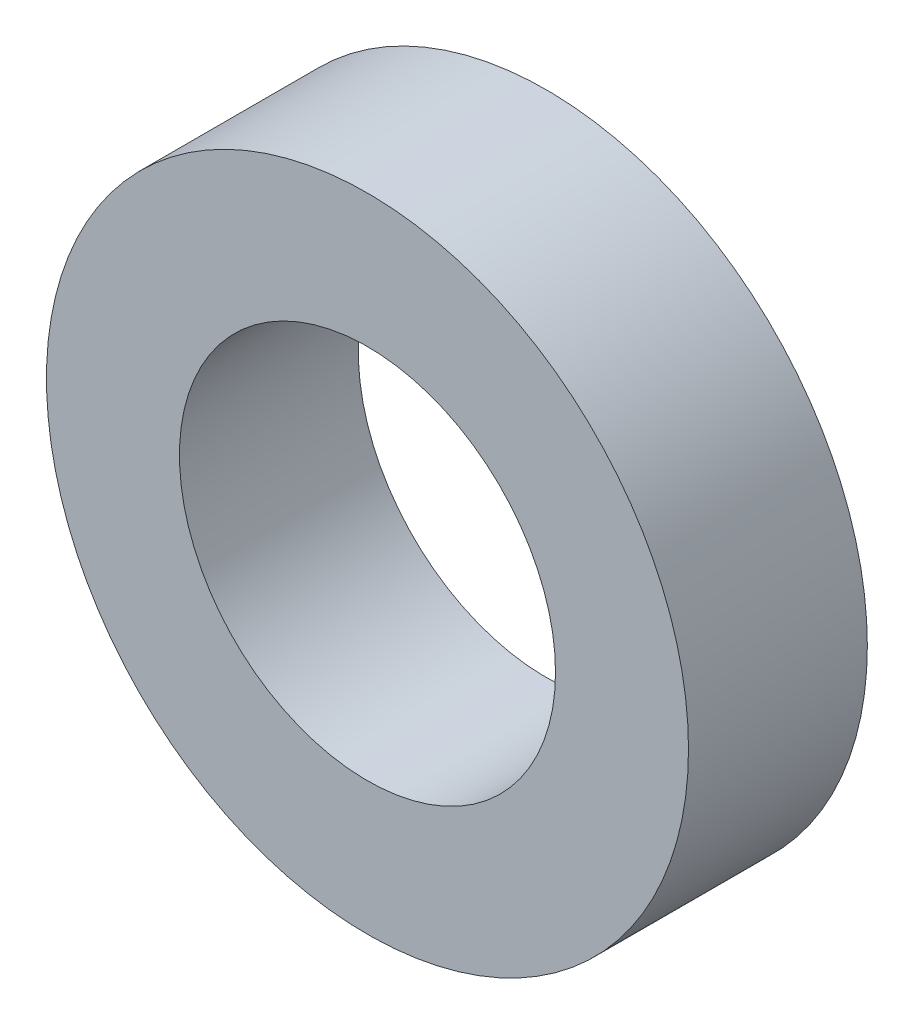
ISO-10303-21;
HEADER;
FILE_DESCRIPTION(('STEP AP214'),'2;1');
FILE_NAME('part.step','',(''),(''),'','','');
FILE_SCHEMA(('AUTOMOTIVE_DESIGN { 1 0 10303 214 1 1 1 1 }'));
ENDSEC;
DATA;
#1=APPLICATION_CONTEXT('core data for automotive mechanical design processes');
#2=APPLICATION_PROTOCOL_DEFINITION('international standard','automotive_design',2000,#1);
#3=PRODUCT_CONTEXT('',#1,'mechanical');
#4=PRODUCT('Part','Part','',(#3));
#5=PRODUCT_RELATED_PRODUCT_CATEGORY('part','',(#4));
#6=PRODUCT_DEFINITION_FORMATION('','',#4);
#7=PRODUCT_DEFINITION_CONTEXT('part definition',#1,'design');
#8=PRODUCT_DEFINITION('design','',#6,#7);
#9=PRODUCT_DEFINITION_SHAPE('','',#8);
#10=(LENGTH_UNIT() NAMED_UNIT(*) SI_UNIT(.MILLI.,.METRE.));
#11=(NAMED_UNIT(*) PLANE_ANGLE_UNIT() SI_UNIT($,.RADIAN.));
#12=(NAMED_UNIT(*) SI_UNIT($,.STERADIAN.) SOLID_ANGLE_UNIT());
#13=UNCERTAINTY_MEASURE_WITH_UNIT(LENGTH_MEASURE(1.E-05),#10,'distance_accuracy_value','');
#14=(GEOMETRIC_REPRESENTATION_CONTEXT(3) GLOBAL_UNCERTAINTY_ASSIGNED_CONTEXT((#13)) GLOBAL_UNIT_ASSIGNED_CONTEXT((#10,
#11,#12)) REPRESENTATION_CONTEXT('',''));
#15=CARTESIAN_POINT('',(0.,0.,0.));
#16=DIRECTION('',(0.,0.,1.));
#17=DIRECTION('',(1.,0.,0.));
#18=AXIS2_PLACEMENT_3D('',#15,#16,#17);
#19=CARTESIAN_POINT('',(0.,0.,7.9248));
#20=DIRECTION('',(0.,0.,-1.));
#21=DIRECTION('',(-1.,0.,0.));
#22=AXIS2_PLACEMENT_3D('',#19,#20,#21);
#23=CYLINDRICAL_SURFACE('',#22,14.224);
#24=CARTESIAN_POINT('',(0.,0.,7.9248));
#25=DIRECTION('',(0.,0.,1.));
#26=DIRECTION('',(1.,0.,0.));
#27=AXIS2_PLACEMENT_3D('',#24,#25,#26);
#28=CIRCLE('',#27,14.224);
#29=CARTESIAN_POINT('',(14.224,0.,7.9248));
#30=VERTEX_POINT('',#29);
#31=EDGE_CURVE('E10',#30,#30,#28,.T.);
#32=ORIENTED_EDGE('',*,*,#31,.F.);
#33=EDGE_LOOP('',(#32));
#34=FACE_BOUND('',#33,.T.);
#35=CARTESIAN_POINT('',(0.,0.,0.));
#36=DIRECTION('',(0.,0.,1.));
#37=DIRECTION('',(1.,0.,0.));
#38=AXIS2_PLACEMENT_3D('',#35,#36,#37);
#39=CIRCLE('',#38,14.224);
#40=CARTESIAN_POINT('',(14.224,0.,0.));
#41=VERTEX_POINT('',#40);
#42=EDGE_CURVE('E44',#41,#41,#39,.T.);
#43=ORIENTED_EDGE('',*,*,#42,.T.);
#44=EDGE_LOOP('',(#43));
#45=FACE_BOUND('',#44,.T.);
#46=ADVANCED_FACE('F41',(#34,#45),#23,.T.);
#47=CARTESIAN_POINT('',(0.,0.,7.9248));
#48=DIRECTION('',(0.,0.,1.));
#49=DIRECTION('',(1.,0.,0.));
#50=AXIS2_PLACEMENT_3D('',#47,#48,#49);
#51=PLANE('',#50);
#52=CARTESIAN_POINT('',(0.,0.,7.9248));
#53=DIRECTION('',(0.,0.,1.));
#54=DIRECTION('',(1.,0.,0.));
#55=AXIS2_PLACEMENT_3D('',#52,#53,#54);
#56=CIRCLE('',#55,8.3312);
#57=CARTESIAN_POINT('',(8.3312,0.,7.9248));
#58=VERTEX_POINT('',#57);
#59=EDGE_CURVE('E51',#58,#58,#56,.T.);
#60=ORIENTED_EDGE('',*,*,#59,.F.);
#61=EDGE_LOOP('',(#60));
#62=FACE_BOUND('',#61,.T.);
#63=ORIENTED_EDGE('',*,*,#31,.T.);
#64=EDGE_LOOP('',(#63));
#65=FACE_BOUND('',#64,.T.);
#66=ADVANCED_FACE('F62',(#62,#65),#51,.T.);
#67=CARTESIAN_POINT('',(0.,0.,0.));
#68=DIRECTION('',(0.,0.,1.));
#69=DIRECTION('',(1.,0.,0.));
#70=AXIS2_PLACEMENT_3D('',#67,#68,#69);
#71=PLANE('',#70);
#72=CARTESIAN_POINT('',(0.,0.,0.));
#73=DIRECTION('',(0.,0.,1.));
#74=DIRECTION('',(1.,0.,0.));
#75=AXIS2_PLACEMENT_3D('',#72,#73,#74);
#76=CIRCLE('',#75,8.3312);
#77=CARTESIAN_POINT('',(8.3312,0.,0.));
#78=VERTEX_POINT('',#77);
#79=EDGE_CURVE('E53',#78,#78,#76,.T.);
#80=ORIENTED_EDGE('',*,*,#79,.T.);
#81=EDGE_LOOP('',(#80));
#82=FACE_BOUND('',#81,.T.);
#83=ORIENTED_EDGE('',*,*,#42,.F.);
#84=EDGE_LOOP('',(#83));
#85=FACE_BOUND('',#84,.T.);
#86=ADVANCED_FACE('F64',(#82,#85),#71,.F.);
#87=CARTESIAN_POINT('',(0.,0.,7.9248));
#88=DIRECTION('',(0.,0.,-1.));
#89=DIRECTION('',(-1.,0.,0.));
#90=AXIS2_PLACEMENT_3D('',#87,#88,#89);
#91=CYLINDRICAL_SURFACE('',#90,8.3312);
#92=ORIENTED_EDGE('',*,*,#59,.T.);
#93=EDGE_LOOP('',(#92));
#94=FACE_BOUND('',#93,.T.);
#95=ORIENTED_EDGE('',*,*,#79,.F.);
#96=EDGE_LOOP('',(#95));
#97=FACE_BOUND('',#96,.T.);
#98=ADVANCED_FACE('F59',(#94,#97),#91,.F.);
#99=CLOSED_SHELL('',(#46,#66,#86,#98));
#100=MANIFOLD_SOLID_BREP('B2',#99);
#101=ADVANCED_BREP_SHAPE_REPRESENTATION('',(#18,#100),#14);
#102=SHAPE_DEFINITION_REPRESENTATION(#9,#101);
ENDSEC;
END-ISO-10303-21;
